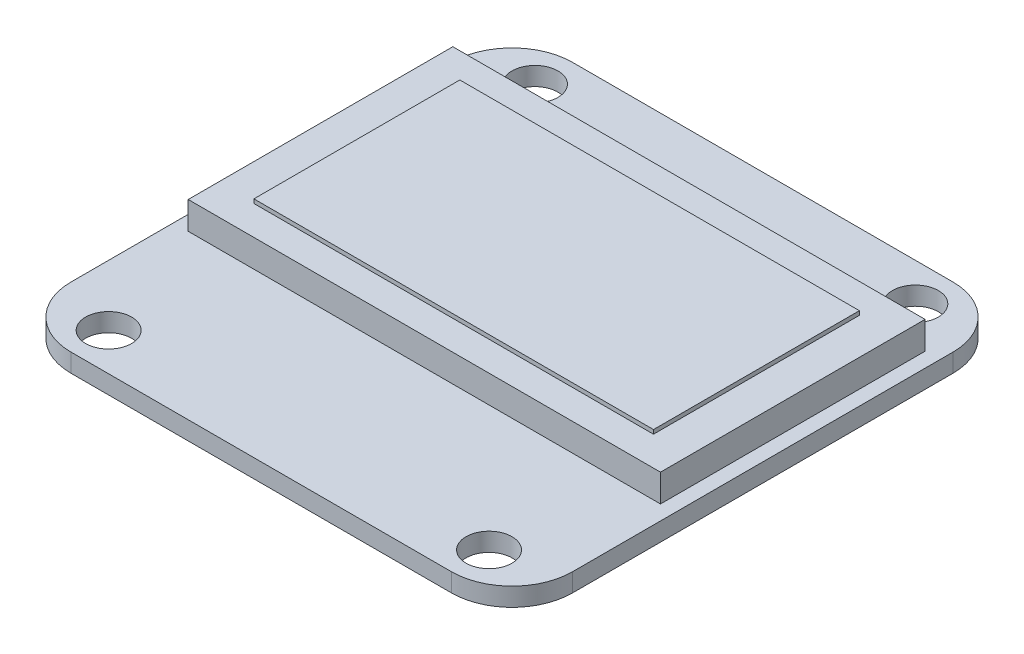
ISO-10303-21;
HEADER;
FILE_DESCRIPTION(('STEP AP214'),'2;1');
FILE_NAME('part.step','',(''),(''),'','','');
FILE_SCHEMA(('AUTOMOTIVE_DESIGN { 1 0 10303 214 1 1 1 1 }'));
ENDSEC;
DATA;
#1=APPLICATION_CONTEXT('core data for automotive mechanical design processes');
#2=APPLICATION_PROTOCOL_DEFINITION('international standard','automotive_design',2000,#1);
#3=PRODUCT_CONTEXT('',#1,'mechanical');
#4=PRODUCT('Part','Part','',(#3));
#5=PRODUCT_RELATED_PRODUCT_CATEGORY('part','',(#4));
#6=PRODUCT_DEFINITION_FORMATION('','',#4);
#7=PRODUCT_DEFINITION_CONTEXT('part definition',#1,'design');
#8=PRODUCT_DEFINITION('design','',#6,#7);
#9=PRODUCT_DEFINITION_SHAPE('','',#8);
#10=(LENGTH_UNIT() NAMED_UNIT(*) SI_UNIT(.MILLI.,.METRE.));
#11=(NAMED_UNIT(*) PLANE_ANGLE_UNIT() SI_UNIT($,.RADIAN.));
#12=(NAMED_UNIT(*) SI_UNIT($,.STERADIAN.) SOLID_ANGLE_UNIT());
#13=UNCERTAINTY_MEASURE_WITH_UNIT(LENGTH_MEASURE(1.E-05),#10,'distance_accuracy_value','');
#14=(GEOMETRIC_REPRESENTATION_CONTEXT(3) GLOBAL_UNCERTAINTY_ASSIGNED_CONTEXT((#13)) GLOBAL_UNIT_ASSIGNED_CONTEXT((#10,
#11,#12)) REPRESENTATION_CONTEXT('',''));
#15=CARTESIAN_POINT('',(0.,0.,0.));
#16=DIRECTION('',(0.,0.,1.));
#17=DIRECTION('',(1.,0.,0.));
#18=AXIS2_PLACEMENT_3D('',#15,#16,#17);
#19=CARTESIAN_POINT('',(-10.35,1.,10.35));
#20=DIRECTION('',(0.,-1.,0.));
#21=DIRECTION('',(0.,0.,-1.));
#22=AXIS2_PLACEMENT_3D('',#19,#20,#21);
#23=PLANE('',#22);
#24=CARTESIAN_POINT('',(-10.35,1.,11.6));
#25=DIRECTION('',(0.,1.,0.));
#26=DIRECTION('',(0.,0.,1.));
#27=AXIS2_PLACEMENT_3D('',#24,#25,#26);
#28=CIRCLE('',#27,1.25);
#29=CARTESIAN_POINT('',(-10.35,1.,12.85));
#30=VERTEX_POINT('',#29);
#31=EDGE_CURVE('E236',#30,#30,#28,.T.);
#32=ORIENTED_EDGE('',*,*,#31,.F.);
#33=EDGE_LOOP('',(#32));
#34=FACE_BOUND('',#33,.T.);
#35=CARTESIAN_POINT('',(10.35,1.,11.6));
#36=DIRECTION('',(0.,1.,0.));
#37=DIRECTION('',(0.,0.,1.));
#38=AXIS2_PLACEMENT_3D('',#35,#36,#37);
#39=CIRCLE('',#38,1.25);
#40=CARTESIAN_POINT('',(10.35,1.,12.85));
#41=VERTEX_POINT('',#40);
#42=EDGE_CURVE('E248',#41,#41,#39,.T.);
#43=ORIENTED_EDGE('',*,*,#42,.F.);
#44=EDGE_LOOP('',(#43));
#45=FACE_BOUND('',#44,.T.);
#46=CARTESIAN_POINT('',(10.35,1.,-11.6));
#47=DIRECTION('',(0.,1.,0.));
#48=DIRECTION('',(0.,0.,1.));
#49=AXIS2_PLACEMENT_3D('',#46,#47,#48);
#50=CIRCLE('',#49,1.25);
#51=CARTESIAN_POINT('',(10.35,1.,-10.35));
#52=VERTEX_POINT('',#51);
#53=EDGE_CURVE('E255',#52,#52,#50,.T.);
#54=ORIENTED_EDGE('',*,*,#53,.F.);
#55=EDGE_LOOP('',(#54));
#56=FACE_BOUND('',#55,.T.);
#57=CARTESIAN_POINT('',(-10.35,1.,-11.6));
#58=DIRECTION('',(0.,1.,0.));
#59=DIRECTION('',(0.,0.,1.));
#60=AXIS2_PLACEMENT_3D('',#57,#58,#59);
#61=CIRCLE('',#60,1.25);
#62=CARTESIAN_POINT('',(-10.35,1.,-10.35));
#63=VERTEX_POINT('',#62);
#64=EDGE_CURVE('E265',#63,#63,#61,.T.);
#65=ORIENTED_EDGE('',*,*,#64,.F.);
#66=EDGE_LOOP('',(#65));
#67=FACE_BOUND('',#66,.T.);
#68=CARTESIAN_POINT('',(-10.35,1.,10.35));
#69=DIRECTION('',(0.,1.,0.));
#70=DIRECTION('',(0.,0.,-1.));
#71=AXIS2_PLACEMENT_3D('',#68,#69,#70);
#72=CIRCLE('',#71,3.3);
#73=CARTESIAN_POINT('',(-13.65,1.,10.35));
#74=VERTEX_POINT('',#73);
#75=CARTESIAN_POINT('',(-10.35,1.,13.65));
#76=VERTEX_POINT('',#75);
#77=EDGE_CURVE('E269',#74,#76,#72,.T.);
#78=ORIENTED_EDGE('',*,*,#77,.T.);
#79=DIRECTION('',(1.,0.,0.));
#80=VECTOR('',#79,1.);
#81=CARTESIAN_POINT('',(-10.35,1.,13.65));
#82=LINE('',#81,#80);
#83=CARTESIAN_POINT('',(10.35,1.,13.65));
#84=VERTEX_POINT('',#83);
#85=EDGE_CURVE('E273',#76,#84,#82,.T.);
#86=ORIENTED_EDGE('',*,*,#85,.T.);
#87=CARTESIAN_POINT('',(10.35,1.,10.35));
#88=DIRECTION('',(0.,1.,0.));
#89=DIRECTION('',(0.,0.,1.));
#90=AXIS2_PLACEMENT_3D('',#87,#88,#89);
#91=CIRCLE('',#90,3.3);
#92=CARTESIAN_POINT('',(13.65,1.,10.35));
#93=VERTEX_POINT('',#92);
#94=EDGE_CURVE('E279',#84,#93,#91,.T.);
#95=ORIENTED_EDGE('',*,*,#94,.T.);
#96=DIRECTION('',(0.,0.,-1.));
#97=VECTOR('',#96,1.);
#98=CARTESIAN_POINT('',(13.65,1.,10.35));
#99=LINE('',#98,#97);
#100=CARTESIAN_POINT('',(13.65,1.,-10.35));
#101=VERTEX_POINT('',#100);
#102=EDGE_CURVE('E282',#93,#101,#99,.T.);
#103=ORIENTED_EDGE('',*,*,#102,.T.);
#104=CARTESIAN_POINT('',(10.35,1.,-10.35));
#105=DIRECTION('',(0.,1.,0.));
#106=DIRECTION('',(0.,0.,-1.));
#107=AXIS2_PLACEMENT_3D('',#104,#105,#106);
#108=CIRCLE('',#107,3.3);
#109=CARTESIAN_POINT('',(10.35,1.,-13.65));
#110=VERTEX_POINT('',#109);
#111=EDGE_CURVE('E281',#101,#110,#108,.T.);
#112=ORIENTED_EDGE('',*,*,#111,.T.);
#113=DIRECTION('',(-1.,0.,0.));
#114=VECTOR('',#113,1.);
#115=CARTESIAN_POINT('',(-10.35,1.,-13.65));
#116=LINE('',#115,#114);
#117=CARTESIAN_POINT('',(-10.35,1.,-13.65));
#118=VERTEX_POINT('',#117);
#119=EDGE_CURVE('E289',#110,#118,#116,.T.);
#120=ORIENTED_EDGE('',*,*,#119,.T.);
#121=CARTESIAN_POINT('',(-10.35,1.,-10.35));
#122=DIRECTION('',(0.,1.,0.));
#123=DIRECTION('',(0.,0.,-1.));
#124=AXIS2_PLACEMENT_3D('',#121,#122,#123);
#125=CIRCLE('',#124,3.3);
#126=CARTESIAN_POINT('',(-13.65,1.,-10.35));
#127=VERTEX_POINT('',#126);
#128=EDGE_CURVE('E286',#118,#127,#125,.T.);
#129=ORIENTED_EDGE('',*,*,#128,.T.);
#130=DIRECTION('',(0.,0.,1.));
#131=VECTOR('',#130,1.);
#132=CARTESIAN_POINT('',(-13.65,1.,10.35));
#133=LINE('',#132,#131);
#134=EDGE_CURVE('E291',#127,#74,#133,.T.);
#135=ORIENTED_EDGE('',*,*,#134,.T.);
#136=EDGE_LOOP('',(#78,#86,#95,#103,#112,#120,#129,#135));
#137=FACE_BOUND('',#136,.T.);
#138=DIRECTION('',(0.,0.,1.));
#139=VECTOR('',#138,1.);
#140=CARTESIAN_POINT('',(-12.85,1.,-9.63));
#141=LINE('',#140,#139);
#142=CARTESIAN_POINT('',(-12.85,1.,-9.63));
#143=VERTEX_POINT('',#142);
#144=CARTESIAN_POINT('',(-12.85,1.,4.77));
#145=VERTEX_POINT('',#144);
#146=EDGE_CURVE('E187',#143,#145,#141,.T.);
#147=ORIENTED_EDGE('',*,*,#146,.F.);
#148=DIRECTION('',(-1.,0.,0.));
#149=VECTOR('',#148,1.);
#150=CARTESIAN_POINT('',(-12.85,1.,-9.63));
#151=LINE('',#150,#149);
#152=CARTESIAN_POINT('',(12.85,1.,-9.63));
#153=VERTEX_POINT('',#152);
#154=EDGE_CURVE('E205',#153,#143,#151,.T.);
#155=ORIENTED_EDGE('',*,*,#154,.F.);
#156=DIRECTION('',(0.,0.,-1.));
#157=VECTOR('',#156,1.);
#158=CARTESIAN_POINT('',(12.85,1.,-9.63));
#159=LINE('',#158,#157);
#160=CARTESIAN_POINT('',(12.85,1.,4.77));
#161=VERTEX_POINT('',#160);
#162=EDGE_CURVE('E214',#161,#153,#159,.T.);
#163=ORIENTED_EDGE('',*,*,#162,.F.);
#164=DIRECTION('',(1.,0.,0.));
#165=VECTOR('',#164,1.);
#166=CARTESIAN_POINT('',(-12.85,1.,4.77));
#167=LINE('',#166,#165);
#168=EDGE_CURVE('E193',#145,#161,#167,.T.);
#169=ORIENTED_EDGE('',*,*,#168,.F.);
#170=EDGE_LOOP('',(#147,#155,#163,#169));
#171=FACE_BOUND('',#170,.T.);
#172=ADVANCED_FACE('F47',(#34,#45,#56,#67,#137,#171),#23,.F.);
#173=CARTESIAN_POINT('',(-10.35,0.,10.35));
#174=DIRECTION('',(0.,-1.,0.));
#175=DIRECTION('',(0.,0.,-1.));
#176=AXIS2_PLACEMENT_3D('',#173,#174,#175);
#177=PLANE('',#176);
#178=CARTESIAN_POINT('',(10.35,0.,11.6));
#179=DIRECTION('',(0.,1.,0.));
#180=DIRECTION('',(0.,0.,1.));
#181=AXIS2_PLACEMENT_3D('',#178,#179,#180);
#182=CIRCLE('',#181,1.25);
#183=CARTESIAN_POINT('',(10.35,0.,12.85));
#184=VERTEX_POINT('',#183);
#185=EDGE_CURVE('E245',#184,#184,#182,.T.);
#186=ORIENTED_EDGE('',*,*,#185,.T.);
#187=EDGE_LOOP('',(#186));
#188=FACE_BOUND('',#187,.T.);
#189=CARTESIAN_POINT('',(-10.35,0.,-11.6));
#190=DIRECTION('',(0.,1.,0.));
#191=DIRECTION('',(0.,0.,1.));
#192=AXIS2_PLACEMENT_3D('',#189,#190,#191);
#193=CIRCLE('',#192,1.25);
#194=CARTESIAN_POINT('',(-10.35,0.,-10.35));
#195=VERTEX_POINT('',#194);
#196=EDGE_CURVE('E256',#195,#195,#193,.T.);
#197=ORIENTED_EDGE('',*,*,#196,.T.);
#198=EDGE_LOOP('',(#197));
#199=FACE_BOUND('',#198,.T.);
#200=CARTESIAN_POINT('',(-10.35,0.,10.35));
#201=DIRECTION('',(0.,1.,0.));
#202=DIRECTION('',(0.,0.,-1.));
#203=AXIS2_PLACEMENT_3D('',#200,#201,#202);
#204=CIRCLE('',#203,3.3);
#205=CARTESIAN_POINT('',(-13.65,0.,10.35));
#206=VERTEX_POINT('',#205);
#207=CARTESIAN_POINT('',(-10.35,0.,13.65));
#208=VERTEX_POINT('',#207);
#209=EDGE_CURVE('E266',#206,#208,#204,.T.);
#210=ORIENTED_EDGE('',*,*,#209,.F.);
#211=DIRECTION('',(0.,0.,1.));
#212=VECTOR('',#211,1.);
#213=CARTESIAN_POINT('',(-13.65,0.,10.35));
#214=LINE('',#213,#212);
#215=CARTESIAN_POINT('',(-13.65,0.,-10.35));
#216=VERTEX_POINT('',#215);
#217=EDGE_CURVE('E274',#216,#206,#214,.T.);
#218=ORIENTED_EDGE('',*,*,#217,.F.);
#219=CARTESIAN_POINT('',(-10.35,0.,-10.35));
#220=DIRECTION('',(0.,1.,0.));
#221=DIRECTION('',(0.,0.,-1.));
#222=AXIS2_PLACEMENT_3D('',#219,#220,#221);
#223=CIRCLE('',#222,3.3);
#224=CARTESIAN_POINT('',(-10.35,0.,-13.65));
#225=VERTEX_POINT('',#224);
#226=EDGE_CURVE('E312',#225,#216,#223,.T.);
#227=ORIENTED_EDGE('',*,*,#226,.F.);
#228=DIRECTION('',(-1.,0.,0.));
#229=VECTOR('',#228,1.);
#230=CARTESIAN_POINT('',(-10.35,0.,-13.65));
#231=LINE('',#230,#229);
#232=CARTESIAN_POINT('',(10.35,0.,-13.65));
#233=VERTEX_POINT('',#232);
#234=EDGE_CURVE('E315',#233,#225,#231,.T.);
#235=ORIENTED_EDGE('',*,*,#234,.F.);
#236=CARTESIAN_POINT('',(10.35,0.,-10.35));
#237=DIRECTION('',(0.,1.,0.));
#238=DIRECTION('',(0.,0.,-1.));
#239=AXIS2_PLACEMENT_3D('',#236,#237,#238);
#240=CIRCLE('',#239,3.3);
#241=CARTESIAN_POINT('',(13.65,0.,-10.35));
#242=VERTEX_POINT('',#241);
#243=EDGE_CURVE('E310',#242,#233,#240,.T.);
#244=ORIENTED_EDGE('',*,*,#243,.F.);
#245=DIRECTION('',(0.,0.,-1.));
#246=VECTOR('',#245,1.);
#247=CARTESIAN_POINT('',(13.65,0.,10.35));
#248=LINE('',#247,#246);
#249=CARTESIAN_POINT('',(13.65,0.,10.35));
#250=VERTEX_POINT('',#249);
#251=EDGE_CURVE('E308',#250,#242,#248,.T.);
#252=ORIENTED_EDGE('',*,*,#251,.F.);
#253=CARTESIAN_POINT('',(10.35,0.,10.35));
#254=DIRECTION('',(0.,1.,0.));
#255=DIRECTION('',(0.,0.,1.));
#256=AXIS2_PLACEMENT_3D('',#253,#254,#255);
#257=CIRCLE('',#256,3.3);
#258=CARTESIAN_POINT('',(10.35,0.,13.65));
#259=VERTEX_POINT('',#258);
#260=EDGE_CURVE('E302',#259,#250,#257,.T.);
#261=ORIENTED_EDGE('',*,*,#260,.F.);
#262=DIRECTION('',(1.,0.,0.));
#263=VECTOR('',#262,1.);
#264=CARTESIAN_POINT('',(-10.35,0.,13.65));
#265=LINE('',#264,#263);
#266=EDGE_CURVE('E298',#208,#259,#265,.T.);
#267=ORIENTED_EDGE('',*,*,#266,.F.);
#268=EDGE_LOOP('',(#210,#218,#227,#235,#244,#252,#261,#267));
#269=FACE_BOUND('',#268,.T.);
#270=CARTESIAN_POINT('',(10.35,0.,-11.6));
#271=DIRECTION('',(0.,1.,0.));
#272=DIRECTION('',(0.,0.,1.));
#273=AXIS2_PLACEMENT_3D('',#270,#271,#272);
#274=CIRCLE('',#273,1.25);
#275=CARTESIAN_POINT('',(10.35,0.,-10.35));
#276=VERTEX_POINT('',#275);
#277=EDGE_CURVE('E246',#276,#276,#274,.T.);
#278=ORIENTED_EDGE('',*,*,#277,.T.);
#279=EDGE_LOOP('',(#278));
#280=FACE_BOUND('',#279,.T.);
#281=CARTESIAN_POINT('',(-10.35,0.,11.6));
#282=DIRECTION('',(0.,1.,0.));
#283=DIRECTION('',(0.,0.,1.));
#284=AXIS2_PLACEMENT_3D('',#281,#282,#283);
#285=CIRCLE('',#284,1.25);
#286=CARTESIAN_POINT('',(-10.35,0.,12.85));
#287=VERTEX_POINT('',#286);
#288=EDGE_CURVE('E240',#287,#287,#285,.T.);
#289=ORIENTED_EDGE('',*,*,#288,.T.);
#290=EDGE_LOOP('',(#289));
#291=FACE_BOUND('',#290,.T.);
#292=ADVANCED_FACE('F351',(#188,#199,#269,#280,#291),#177,.T.);
#293=CARTESIAN_POINT('',(-10.35,1.,10.35));
#294=DIRECTION('',(0.,-1.,0.));
#295=DIRECTION('',(0.,0.,-1.));
#296=AXIS2_PLACEMENT_3D('',#293,#294,#295);
#297=CYLINDRICAL_SURFACE('',#296,3.3);
#298=ORIENTED_EDGE('',*,*,#209,.T.);
#299=DIRECTION('',(0.,-1.,0.));
#300=VECTOR('',#299,1.);
#301=CARTESIAN_POINT('',(-10.35,1.,13.65));
#302=LINE('',#301,#300);
#303=EDGE_CURVE('E11',#76,#208,#302,.T.);
#304=ORIENTED_EDGE('',*,*,#303,.F.);
#305=ORIENTED_EDGE('',*,*,#77,.F.);
#306=DIRECTION('',(0.,-1.,0.));
#307=VECTOR('',#306,1.);
#308=CARTESIAN_POINT('',(-13.65,1.,10.35));
#309=LINE('',#308,#307);
#310=EDGE_CURVE('E297',#74,#206,#309,.T.);
#311=ORIENTED_EDGE('',*,*,#310,.T.);
#312=EDGE_LOOP('',(#298,#304,#305,#311));
#313=FACE_BOUND('',#312,.T.);
#314=ADVANCED_FACE('F51',(#313),#297,.T.);
#315=CARTESIAN_POINT('',(-10.35,1.,13.65));
#316=DIRECTION('',(0.,0.,-1.));
#317=DIRECTION('',(-1.,0.,0.));
#318=AXIS2_PLACEMENT_3D('',#315,#316,#317);
#319=PLANE('',#318);
#320=ORIENTED_EDGE('',*,*,#266,.T.);
#321=DIRECTION('',(0.,-1.,0.));
#322=VECTOR('',#321,1.);
#323=CARTESIAN_POINT('',(10.35,1.,13.65));
#324=LINE('',#323,#322);
#325=EDGE_CURVE('E59',#84,#259,#324,.T.);
#326=ORIENTED_EDGE('',*,*,#325,.F.);
#327=ORIENTED_EDGE('',*,*,#85,.F.);
#328=ORIENTED_EDGE('',*,*,#303,.T.);
#329=EDGE_LOOP('',(#320,#326,#327,#328));
#330=FACE_BOUND('',#329,.T.);
#331=ADVANCED_FACE('F375',(#330),#319,.F.);
#332=CARTESIAN_POINT('',(10.35,1.,10.35));
#333=DIRECTION('',(0.,-1.,0.));
#334=DIRECTION('',(0.,0.,-1.));
#335=AXIS2_PLACEMENT_3D('',#332,#333,#334);
#336=CYLINDRICAL_SURFACE('',#335,3.3);
#337=ORIENTED_EDGE('',*,*,#260,.T.);
#338=DIRECTION('',(0.,-1.,0.));
#339=VECTOR('',#338,1.);
#340=CARTESIAN_POINT('',(13.65,1.,10.35));
#341=LINE('',#340,#339);
#342=EDGE_CURVE('E336',#93,#250,#341,.T.);
#343=ORIENTED_EDGE('',*,*,#342,.F.);
#344=ORIENTED_EDGE('',*,*,#94,.F.);
#345=ORIENTED_EDGE('',*,*,#325,.T.);
#346=EDGE_LOOP('',(#337,#343,#344,#345));
#347=FACE_BOUND('',#346,.T.);
#348=ADVANCED_FACE('F346',(#347),#336,.T.);
#349=CARTESIAN_POINT('',(13.65,1.,10.35));
#350=DIRECTION('',(-1.,0.,0.));
#351=DIRECTION('',(0.,0.,1.));
#352=AXIS2_PLACEMENT_3D('',#349,#350,#351);
#353=PLANE('',#352);
#354=ORIENTED_EDGE('',*,*,#251,.T.);
#355=DIRECTION('',(0.,-1.,0.));
#356=VECTOR('',#355,1.);
#357=CARTESIAN_POINT('',(13.65,1.,-10.35));
#358=LINE('',#357,#356);
#359=EDGE_CURVE('E333',#101,#242,#358,.T.);
#360=ORIENTED_EDGE('',*,*,#359,.F.);
#361=ORIENTED_EDGE('',*,*,#102,.F.);
#362=ORIENTED_EDGE('',*,*,#342,.T.);
#363=EDGE_LOOP('',(#354,#360,#361,#362));
#364=FACE_BOUND('',#363,.T.);
#365=ADVANCED_FACE('F356',(#364),#353,.F.);
#366=CARTESIAN_POINT('',(10.35,1.,-10.35));
#367=DIRECTION('',(0.,-1.,0.));
#368=DIRECTION('',(0.,0.,-1.));
#369=AXIS2_PLACEMENT_3D('',#366,#367,#368);
#370=CYLINDRICAL_SURFACE('',#369,3.3);
#371=ORIENTED_EDGE('',*,*,#243,.T.);
#372=DIRECTION('',(0.,-1.,0.));
#373=VECTOR('',#372,1.);
#374=CARTESIAN_POINT('',(10.35,1.,-13.65));
#375=LINE('',#374,#373);
#376=EDGE_CURVE('E332',#110,#233,#375,.T.);
#377=ORIENTED_EDGE('',*,*,#376,.F.);
#378=ORIENTED_EDGE('',*,*,#111,.F.);
#379=ORIENTED_EDGE('',*,*,#359,.T.);
#380=EDGE_LOOP('',(#371,#377,#378,#379));
#381=FACE_BOUND('',#380,.T.);
#382=ADVANCED_FACE('F365',(#381),#370,.T.);
#383=CARTESIAN_POINT('',(-10.35,1.,-13.65));
#384=DIRECTION('',(0.,0.,1.));
#385=DIRECTION('',(1.,0.,0.));
#386=AXIS2_PLACEMENT_3D('',#383,#384,#385);
#387=PLANE('',#386);
#388=ORIENTED_EDGE('',*,*,#234,.T.);
#389=DIRECTION('',(0.,-1.,0.));
#390=VECTOR('',#389,1.);
#391=CARTESIAN_POINT('',(-10.35,1.,-13.65));
#392=LINE('',#391,#390);
#393=EDGE_CURVE('E330',#118,#225,#392,.T.);
#394=ORIENTED_EDGE('',*,*,#393,.F.);
#395=ORIENTED_EDGE('',*,*,#119,.F.);
#396=ORIENTED_EDGE('',*,*,#376,.T.);
#397=EDGE_LOOP('',(#388,#394,#395,#396));
#398=FACE_BOUND('',#397,.T.);
#399=ADVANCED_FACE('F384',(#398),#387,.F.);
#400=CARTESIAN_POINT('',(-10.35,1.,-10.35));
#401=DIRECTION('',(0.,-1.,0.));
#402=DIRECTION('',(0.,0.,-1.));
#403=AXIS2_PLACEMENT_3D('',#400,#401,#402);
#404=CYLINDRICAL_SURFACE('',#403,3.3);
#405=ORIENTED_EDGE('',*,*,#226,.T.);
#406=DIRECTION('',(0.,-1.,0.));
#407=VECTOR('',#406,1.);
#408=CARTESIAN_POINT('',(-13.65,1.,-10.35));
#409=LINE('',#408,#407);
#410=EDGE_CURVE('E323',#127,#216,#409,.T.);
#411=ORIENTED_EDGE('',*,*,#410,.F.);
#412=ORIENTED_EDGE('',*,*,#128,.F.);
#413=ORIENTED_EDGE('',*,*,#393,.T.);
#414=EDGE_LOOP('',(#405,#411,#412,#413));
#415=FACE_BOUND('',#414,.T.);
#416=ADVANCED_FACE('F382',(#415),#404,.T.);
#417=CARTESIAN_POINT('',(-13.65,1.,10.35));
#418=DIRECTION('',(1.,0.,0.));
#419=DIRECTION('',(0.,0.,-1.));
#420=AXIS2_PLACEMENT_3D('',#417,#418,#419);
#421=PLANE('',#420);
#422=ORIENTED_EDGE('',*,*,#217,.T.);
#423=ORIENTED_EDGE('',*,*,#310,.F.);
#424=ORIENTED_EDGE('',*,*,#134,.F.);
#425=ORIENTED_EDGE('',*,*,#410,.T.);
#426=EDGE_LOOP('',(#422,#423,#424,#425));
#427=FACE_BOUND('',#426,.T.);
#428=ADVANCED_FACE('F378',(#427),#421,.F.);
#429=CARTESIAN_POINT('',(-10.35,1.,-11.6));
#430=DIRECTION('',(0.,-1.,0.));
#431=DIRECTION('',(0.,0.,-1.));
#432=AXIS2_PLACEMENT_3D('',#429,#430,#431);
#433=CYLINDRICAL_SURFACE('',#432,1.25);
#434=ORIENTED_EDGE('',*,*,#64,.T.);
#435=EDGE_LOOP('',(#434));
#436=FACE_BOUND('',#435,.T.);
#437=ORIENTED_EDGE('',*,*,#196,.F.);
#438=EDGE_LOOP('',(#437));
#439=FACE_BOUND('',#438,.T.);
#440=ADVANCED_FACE('F410',(#436,#439),#433,.F.);
#441=CARTESIAN_POINT('',(10.35,1.,-11.6));
#442=DIRECTION('',(0.,-1.,0.));
#443=DIRECTION('',(0.,0.,-1.));
#444=AXIS2_PLACEMENT_3D('',#441,#442,#443);
#445=CYLINDRICAL_SURFACE('',#444,1.25);
#446=ORIENTED_EDGE('',*,*,#53,.T.);
#447=EDGE_LOOP('',(#446));
#448=FACE_BOUND('',#447,.T.);
#449=ORIENTED_EDGE('',*,*,#277,.F.);
#450=EDGE_LOOP('',(#449));
#451=FACE_BOUND('',#450,.T.);
#452=ADVANCED_FACE('F415',(#448,#451),#445,.F.);
#453=CARTESIAN_POINT('',(10.35,1.,11.6));
#454=DIRECTION('',(0.,-1.,0.));
#455=DIRECTION('',(0.,0.,-1.));
#456=AXIS2_PLACEMENT_3D('',#453,#454,#455);
#457=CYLINDRICAL_SURFACE('',#456,1.25);
#458=ORIENTED_EDGE('',*,*,#42,.T.);
#459=EDGE_LOOP('',(#458));
#460=FACE_BOUND('',#459,.T.);
#461=ORIENTED_EDGE('',*,*,#185,.F.);
#462=EDGE_LOOP('',(#461));
#463=FACE_BOUND('',#462,.T.);
#464=ADVANCED_FACE('F420',(#460,#463),#457,.F.);
#465=CARTESIAN_POINT('',(-10.35,1.,11.6));
#466=DIRECTION('',(0.,-1.,0.));
#467=DIRECTION('',(0.,0.,-1.));
#468=AXIS2_PLACEMENT_3D('',#465,#466,#467);
#469=CYLINDRICAL_SURFACE('',#468,1.25);
#470=ORIENTED_EDGE('',*,*,#31,.T.);
#471=EDGE_LOOP('',(#470));
#472=FACE_BOUND('',#471,.T.);
#473=ORIENTED_EDGE('',*,*,#288,.F.);
#474=EDGE_LOOP('',(#473));
#475=FACE_BOUND('',#474,.T.);
#476=ADVANCED_FACE('F427',(#472,#475),#469,.F.);
#477=CARTESIAN_POINT('',(-12.85,2.5,-9.63));
#478=DIRECTION('',(1.,0.,0.));
#479=DIRECTION('',(0.,0.,-1.));
#480=AXIS2_PLACEMENT_3D('',#477,#478,#479);
#481=PLANE('',#480);
#482=ORIENTED_EDGE('',*,*,#146,.T.);
#483=DIRECTION('',(0.,-1.,0.));
#484=VECTOR('',#483,1.);
#485=CARTESIAN_POINT('',(-12.85,2.5,4.77));
#486=LINE('',#485,#484);
#487=CARTESIAN_POINT('',(-12.85,2.5,4.77));
#488=VERTEX_POINT('',#487);
#489=EDGE_CURVE('E232',#488,#145,#486,.T.);
#490=ORIENTED_EDGE('',*,*,#489,.F.);
#491=DIRECTION('',(0.,0.,1.));
#492=VECTOR('',#491,1.);
#493=CARTESIAN_POINT('',(-12.85,2.5,-9.63));
#494=LINE('',#493,#492);
#495=CARTESIAN_POINT('',(-12.85,2.5,-9.63));
#496=VERTEX_POINT('',#495);
#497=EDGE_CURVE('E197',#496,#488,#494,.T.);
#498=ORIENTED_EDGE('',*,*,#497,.F.);
#499=DIRECTION('',(0.,-1.,0.));
#500=VECTOR('',#499,1.);
#501=CARTESIAN_POINT('',(-12.85,2.5,-9.63));
#502=LINE('',#501,#500);
#503=EDGE_CURVE('E209',#496,#143,#502,.T.);
#504=ORIENTED_EDGE('',*,*,#503,.T.);
#505=EDGE_LOOP('',(#482,#490,#498,#504));
#506=FACE_BOUND('',#505,.T.);
#507=ADVANCED_FACE('F434',(#506),#481,.F.);
#508=CARTESIAN_POINT('',(-12.85,2.5,4.77));
#509=DIRECTION('',(0.,0.,-1.));
#510=DIRECTION('',(-1.,0.,0.));
#511=AXIS2_PLACEMENT_3D('',#508,#509,#510);
#512=PLANE('',#511);
#513=ORIENTED_EDGE('',*,*,#168,.T.);
#514=DIRECTION('',(0.,-1.,0.));
#515=VECTOR('',#514,1.);
#516=CARTESIAN_POINT('',(12.85,2.5,4.77));
#517=LINE('',#516,#515);
#518=CARTESIAN_POINT('',(12.85,2.5,4.77));
#519=VERTEX_POINT('',#518);
#520=EDGE_CURVE('E226',#519,#161,#517,.T.);
#521=ORIENTED_EDGE('',*,*,#520,.F.);
#522=DIRECTION('',(1.,0.,0.));
#523=VECTOR('',#522,1.);
#524=CARTESIAN_POINT('',(-12.85,2.5,4.77));
#525=LINE('',#524,#523);
#526=EDGE_CURVE('E203',#488,#519,#525,.T.);
#527=ORIENTED_EDGE('',*,*,#526,.F.);
#528=ORIENTED_EDGE('',*,*,#489,.T.);
#529=EDGE_LOOP('',(#513,#521,#527,#528));
#530=FACE_BOUND('',#529,.T.);
#531=ADVANCED_FACE('F437',(#530),#512,.F.);
#532=CARTESIAN_POINT('',(12.85,2.5,-9.63));
#533=DIRECTION('',(-1.,0.,0.));
#534=DIRECTION('',(0.,0.,1.));
#535=AXIS2_PLACEMENT_3D('',#532,#533,#534);
#536=PLANE('',#535);
#537=ORIENTED_EDGE('',*,*,#162,.T.);
#538=DIRECTION('',(0.,-1.,0.));
#539=VECTOR('',#538,1.);
#540=CARTESIAN_POINT('',(12.85,2.5,-9.63));
#541=LINE('',#540,#539);
#542=CARTESIAN_POINT('',(12.85,2.5,-9.63));
#543=VERTEX_POINT('',#542);
#544=EDGE_CURVE('E223',#543,#153,#541,.T.);
#545=ORIENTED_EDGE('',*,*,#544,.F.);
#546=DIRECTION('',(0.,0.,-1.));
#547=VECTOR('',#546,1.);
#548=CARTESIAN_POINT('',(12.85,2.5,-9.63));
#549=LINE('',#548,#547);
#550=EDGE_CURVE('E202',#519,#543,#549,.T.);
#551=ORIENTED_EDGE('',*,*,#550,.F.);
#552=ORIENTED_EDGE('',*,*,#520,.T.);
#553=EDGE_LOOP('',(#537,#545,#551,#552));
#554=FACE_BOUND('',#553,.T.);
#555=ADVANCED_FACE('F445',(#554),#536,.F.);
#556=CARTESIAN_POINT('',(-12.85,2.5,-9.63));
#557=DIRECTION('',(0.,0.,1.));
#558=DIRECTION('',(1.,0.,0.));
#559=AXIS2_PLACEMENT_3D('',#556,#557,#558);
#560=PLANE('',#559);
#561=ORIENTED_EDGE('',*,*,#154,.T.);
#562=ORIENTED_EDGE('',*,*,#503,.F.);
#563=DIRECTION('',(-1.,0.,0.));
#564=VECTOR('',#563,1.);
#565=CARTESIAN_POINT('',(-12.85,2.5,-9.63));
#566=LINE('',#565,#564);
#567=EDGE_CURVE('E208',#543,#496,#566,.T.);
#568=ORIENTED_EDGE('',*,*,#567,.F.);
#569=ORIENTED_EDGE('',*,*,#544,.T.);
#570=EDGE_LOOP('',(#561,#562,#568,#569));
#571=FACE_BOUND('',#570,.T.);
#572=ADVANCED_FACE('F447',(#571),#560,.F.);
#573=CARTESIAN_POINT('',(0.,2.5,0.));
#574=DIRECTION('',(0.,1.,0.));
#575=DIRECTION('',(0.,0.,1.));
#576=AXIS2_PLACEMENT_3D('',#573,#574,#575);
#577=PLANE('',#576);
#578=DIRECTION('',(0.,0.,-1.));
#579=VECTOR('',#578,1.);
#580=CARTESIAN_POINT('',(10.872,2.5,-8.032));
#581=LINE('',#580,#579);
#582=CARTESIAN_POINT('',(10.872,2.5,3.172));
#583=VERTEX_POINT('',#582);
#584=CARTESIAN_POINT('',(10.872,2.5,-8.032));
#585=VERTEX_POINT('',#584);
#586=EDGE_CURVE('E63',#583,#585,#581,.T.);
#587=ORIENTED_EDGE('',*,*,#586,.F.);
#588=DIRECTION('',(1.,0.,0.));
#589=VECTOR('',#588,1.);
#590=CARTESIAN_POINT('',(-10.872,2.5,3.172));
#591=LINE('',#590,#589);
#592=CARTESIAN_POINT('',(-10.872,2.5,3.172));
#593=VERTEX_POINT('',#592);
#594=EDGE_CURVE('E70',#593,#583,#591,.T.);
#595=ORIENTED_EDGE('',*,*,#594,.F.);
#596=DIRECTION('',(0.,0.,1.));
#597=VECTOR('',#596,1.);
#598=CARTESIAN_POINT('',(-10.872,2.5,-8.032));
#599=LINE('',#598,#597);
#600=CARTESIAN_POINT('',(-10.872,2.5,-8.032));
#601=VERTEX_POINT('',#600);
#602=EDGE_CURVE('E633',#601,#593,#599,.T.);
#603=ORIENTED_EDGE('',*,*,#602,.F.);
#604=DIRECTION('',(-1.,0.,0.));
#605=VECTOR('',#604,1.);
#606=CARTESIAN_POINT('',(-10.872,2.5,-8.032));
#607=LINE('',#606,#605);
#608=EDGE_CURVE('E643',#585,#601,#607,.T.);
#609=ORIENTED_EDGE('',*,*,#608,.F.);
#610=EDGE_LOOP('',(#587,#595,#603,#609));
#611=FACE_BOUND('',#610,.T.);
#612=ORIENTED_EDGE('',*,*,#497,.T.);
#613=ORIENTED_EDGE('',*,*,#526,.T.);
#614=ORIENTED_EDGE('',*,*,#550,.T.);
#615=ORIENTED_EDGE('',*,*,#567,.T.);
#616=EDGE_LOOP('',(#612,#613,#614,#615));
#617=FACE_BOUND('',#616,.T.);
#618=ADVANCED_FACE('F448',(#611,#617),#577,.T.);
#619=CARTESIAN_POINT('',(10.872,2.72,-8.032));
#620=DIRECTION('',(-1.,0.,0.));
#621=DIRECTION('',(0.,0.,1.));
#622=AXIS2_PLACEMENT_3D('',#619,#620,#621);
#623=PLANE('',#622);
#624=ORIENTED_EDGE('',*,*,#586,.T.);
#625=DIRECTION('',(0.,-1.,0.));
#626=VECTOR('',#625,1.);
#627=CARTESIAN_POINT('',(10.872,2.72,-8.032));
#628=LINE('',#627,#626);
#629=CARTESIAN_POINT('',(10.872,2.72,-8.032));
#630=VERTEX_POINT('',#629);
#631=EDGE_CURVE('E167',#630,#585,#628,.T.);
#632=ORIENTED_EDGE('',*,*,#631,.F.);
#633=DIRECTION('',(0.,0.,-1.));
#634=VECTOR('',#633,1.);
#635=CARTESIAN_POINT('',(10.872,2.72,-8.032));
#636=LINE('',#635,#634);
#637=CARTESIAN_POINT('',(10.872,2.72,3.172));
#638=VERTEX_POINT('',#637);
#639=EDGE_CURVE('E174',#638,#630,#636,.T.);
#640=ORIENTED_EDGE('',*,*,#639,.F.);
#641=DIRECTION('',(0.,-1.,0.));
#642=VECTOR('',#641,1.);
#643=CARTESIAN_POINT('',(10.872,2.72,3.172));
#644=LINE('',#643,#642);
#645=EDGE_CURVE('E629',#638,#583,#644,.T.);
#646=ORIENTED_EDGE('',*,*,#645,.T.);
#647=EDGE_LOOP('',(#624,#632,#640,#646));
#648=FACE_BOUND('',#647,.T.);
#649=ADVANCED_FACE('F184',(#648),#623,.F.);
#650=CARTESIAN_POINT('',(-10.872,2.72,-8.032));
#651=DIRECTION('',(0.,0.,1.));
#652=DIRECTION('',(1.,0.,0.));
#653=AXIS2_PLACEMENT_3D('',#650,#651,#652);
#654=PLANE('',#653);
#655=ORIENTED_EDGE('',*,*,#608,.T.);
#656=DIRECTION('',(0.,-1.,0.));
#657=VECTOR('',#656,1.);
#658=CARTESIAN_POINT('',(-10.872,2.72,-8.032));
#659=LINE('',#658,#657);
#660=CARTESIAN_POINT('',(-10.872,2.72,-8.032));
#661=VERTEX_POINT('',#660);
#662=EDGE_CURVE('E169',#661,#601,#659,.T.);
#663=ORIENTED_EDGE('',*,*,#662,.F.);
#664=DIRECTION('',(-1.,0.,0.));
#665=VECTOR('',#664,1.);
#666=CARTESIAN_POINT('',(-10.872,2.72,-8.032));
#667=LINE('',#666,#665);
#668=EDGE_CURVE('E161',#630,#661,#667,.T.);
#669=ORIENTED_EDGE('',*,*,#668,.F.);
#670=ORIENTED_EDGE('',*,*,#631,.T.);
#671=EDGE_LOOP('',(#655,#663,#669,#670));
#672=FACE_BOUND('',#671,.T.);
#673=ADVANCED_FACE('F163',(#672),#654,.F.);
#674=CARTESIAN_POINT('',(-10.872,2.72,-8.032));
#675=DIRECTION('',(1.,0.,0.));
#676=DIRECTION('',(0.,0.,-1.));
#677=AXIS2_PLACEMENT_3D('',#674,#675,#676);
#678=PLANE('',#677);
#679=ORIENTED_EDGE('',*,*,#602,.T.);
#680=DIRECTION('',(0.,-1.,0.));
#681=VECTOR('',#680,1.);
#682=CARTESIAN_POINT('',(-10.872,2.72,3.172));
#683=LINE('',#682,#681);
#684=CARTESIAN_POINT('',(-10.872,2.72,3.172));
#685=VERTEX_POINT('',#684);
#686=EDGE_CURVE('E192',#685,#593,#683,.T.);
#687=ORIENTED_EDGE('',*,*,#686,.F.);
#688=DIRECTION('',(0.,0.,1.));
#689=VECTOR('',#688,1.);
#690=CARTESIAN_POINT('',(-10.872,2.72,-8.032));
#691=LINE('',#690,#689);
#692=EDGE_CURVE('E175',#661,#685,#691,.T.);
#693=ORIENTED_EDGE('',*,*,#692,.F.);
#694=ORIENTED_EDGE('',*,*,#662,.T.);
#695=EDGE_LOOP('',(#679,#687,#693,#694));
#696=FACE_BOUND('',#695,.T.);
#697=ADVANCED_FACE('F456',(#696),#678,.F.);
#698=CARTESIAN_POINT('',(-10.872,2.72,3.172));
#699=DIRECTION('',(0.,0.,-1.));
#700=DIRECTION('',(-1.,0.,0.));
#701=AXIS2_PLACEMENT_3D('',#698,#699,#700);
#702=PLANE('',#701);
#703=ORIENTED_EDGE('',*,*,#594,.T.);
#704=ORIENTED_EDGE('',*,*,#645,.F.);
#705=DIRECTION('',(1.,0.,0.));
#706=VECTOR('',#705,1.);
#707=CARTESIAN_POINT('',(-10.872,2.72,3.172));
#708=LINE('',#707,#706);
#709=EDGE_CURVE('E177',#685,#638,#708,.T.);
#710=ORIENTED_EDGE('',*,*,#709,.F.);
#711=ORIENTED_EDGE('',*,*,#686,.T.);
#712=EDGE_LOOP('',(#703,#704,#710,#711));
#713=FACE_BOUND('',#712,.T.);
#714=ADVANCED_FACE('F462',(#713),#702,.F.);
#715=CARTESIAN_POINT('',(0.,2.72,0.));
#716=DIRECTION('',(0.,1.,0.));
#717=DIRECTION('',(0.,0.,1.));
#718=AXIS2_PLACEMENT_3D('',#715,#716,#717);
#719=PLANE('',#718);
#720=ORIENTED_EDGE('',*,*,#639,.T.);
#721=ORIENTED_EDGE('',*,*,#668,.T.);
#722=ORIENTED_EDGE('',*,*,#692,.T.);
#723=ORIENTED_EDGE('',*,*,#709,.T.);
#724=EDGE_LOOP('',(#720,#721,#722,#723));
#725=FACE_BOUND('',#724,.T.);
#726=ADVANCED_FACE('F178',(#725),#719,.T.);
#727=CLOSED_SHELL('',(#172,#292,#314,#331,#348,#365,#382,#399,#416,#428,#440,#452,#464,#476,
#507,#531,#555,#572,#618,#649,#673,#697,#714,#726));
#728=MANIFOLD_SOLID_BREP('B2',#727);
#729=ADVANCED_BREP_SHAPE_REPRESENTATION('',(#18,#728),#14);
#730=SHAPE_DEFINITION_REPRESENTATION(#9,#729);
ENDSEC;
END-ISO-10303-21;
